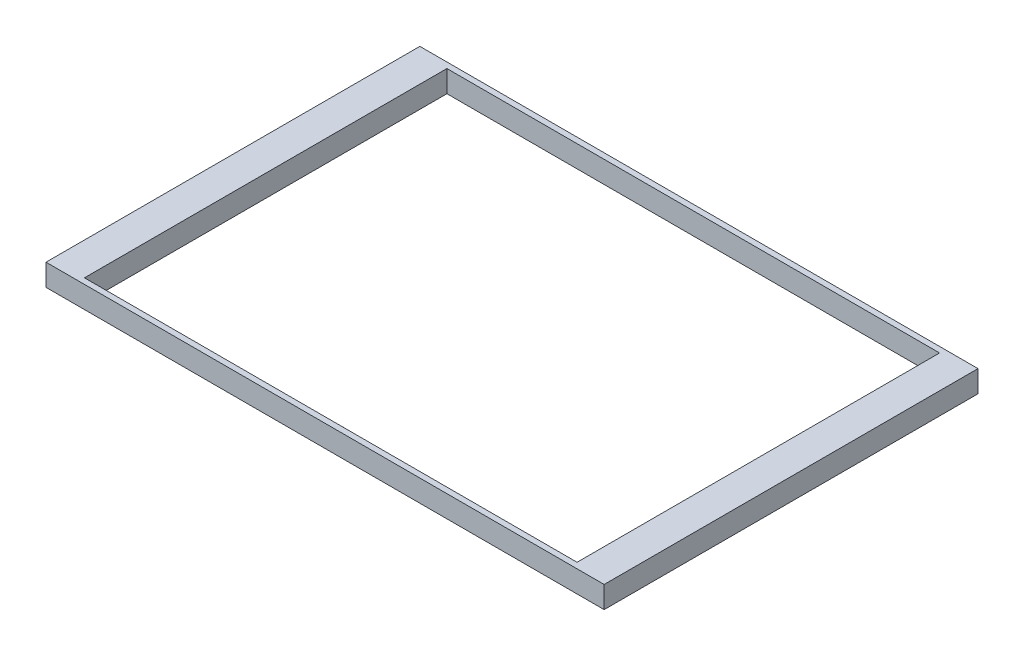
ISO-10303-21;
HEADER;
FILE_DESCRIPTION(('STEP AP214'),'2;1');
FILE_NAME('part.step','',(''),(''),'','','');
FILE_SCHEMA(('AUTOMOTIVE_DESIGN { 1 0 10303 214 1 1 1 1 }'));
ENDSEC;
DATA;
#1=APPLICATION_CONTEXT('core data for automotive mechanical design processes');
#2=APPLICATION_PROTOCOL_DEFINITION('international standard','automotive_design',2000,#1);
#3=PRODUCT_CONTEXT('',#1,'mechanical');
#4=PRODUCT('Part','Part','',(#3));
#5=PRODUCT_RELATED_PRODUCT_CATEGORY('part','',(#4));
#6=PRODUCT_DEFINITION_FORMATION('','',#4);
#7=PRODUCT_DEFINITION_CONTEXT('part definition',#1,'design');
#8=PRODUCT_DEFINITION('design','',#6,#7);
#9=PRODUCT_DEFINITION_SHAPE('','',#8);
#10=(LENGTH_UNIT() NAMED_UNIT(*) SI_UNIT(.MILLI.,.METRE.));
#11=(NAMED_UNIT(*) PLANE_ANGLE_UNIT() SI_UNIT($,.RADIAN.));
#12=(NAMED_UNIT(*) SI_UNIT($,.STERADIAN.) SOLID_ANGLE_UNIT());
#13=UNCERTAINTY_MEASURE_WITH_UNIT(LENGTH_MEASURE(1.E-05),#10,'distance_accuracy_value','');
#14=(GEOMETRIC_REPRESENTATION_CONTEXT(3) GLOBAL_UNCERTAINTY_ASSIGNED_CONTEXT((#13)) GLOBAL_UNIT_ASSIGNED_CONTEXT((#10,
#11,#12)) REPRESENTATION_CONTEXT('',''));
#15=CARTESIAN_POINT('',(0.,0.,0.));
#16=DIRECTION('',(0.,0.,1.));
#17=DIRECTION('',(1.,0.,0.));
#18=AXIS2_PLACEMENT_3D('',#15,#16,#17);
#19=CARTESIAN_POINT('',(-63.9,5.,42.8));
#20=DIRECTION('',(1.,0.,0.));
#21=DIRECTION('',(0.,0.,-1.));
#22=AXIS2_PLACEMENT_3D('',#19,#20,#21);
#23=PLANE('',#22);
#24=DIRECTION('',(0.,0.,1.));
#25=VECTOR('',#24,1.);
#26=CARTESIAN_POINT('',(-63.9,0.,42.8));
#27=LINE('',#26,#25);
#28=CARTESIAN_POINT('',(-63.9,0.,-42.8));
#29=VERTEX_POINT('',#28);
#30=CARTESIAN_POINT('',(-63.9,0.,42.8));
#31=VERTEX_POINT('',#30);
#32=EDGE_CURVE('E147',#29,#31,#27,.T.);
#33=ORIENTED_EDGE('',*,*,#32,.T.);
#34=DIRECTION('',(0.,-1.,0.));
#35=VECTOR('',#34,1.);
#36=CARTESIAN_POINT('',(-63.9,5.,42.8));
#37=LINE('',#36,#35);
#38=CARTESIAN_POINT('',(-63.9,5.,42.8));
#39=VERTEX_POINT('',#38);
#40=EDGE_CURVE('E11',#39,#31,#37,.T.);
#41=ORIENTED_EDGE('',*,*,#40,.F.);
#42=DIRECTION('',(0.,0.,1.));
#43=VECTOR('',#42,1.);
#44=CARTESIAN_POINT('',(-63.9,5.,42.8));
#45=LINE('',#44,#43);
#46=CARTESIAN_POINT('',(-63.9,5.,-42.8));
#47=VERTEX_POINT('',#46);
#48=EDGE_CURVE('E153',#47,#39,#45,.T.);
#49=ORIENTED_EDGE('',*,*,#48,.F.);
#50=DIRECTION('',(0.,-1.,0.));
#51=VECTOR('',#50,1.);
#52=CARTESIAN_POINT('',(-63.9,5.,-42.8));
#53=LINE('',#52,#51);
#54=EDGE_CURVE('E167',#47,#29,#53,.T.);
#55=ORIENTED_EDGE('',*,*,#54,.T.);
#56=EDGE_LOOP('',(#33,#41,#49,#55));
#57=FACE_BOUND('',#56,.T.);
#58=ADVANCED_FACE('F39',(#57),#23,.F.);
#59=CARTESIAN_POINT('',(63.9,5.,42.8));
#60=DIRECTION('',(0.,0.,-1.));
#61=DIRECTION('',(-1.,0.,0.));
#62=AXIS2_PLACEMENT_3D('',#59,#60,#61);
#63=PLANE('',#62);
#64=DIRECTION('',(1.,0.,0.));
#65=VECTOR('',#64,1.);
#66=CARTESIAN_POINT('',(63.9,0.,42.8));
#67=LINE('',#66,#65);
#68=CARTESIAN_POINT('',(63.9,0.,42.8));
#69=VERTEX_POINT('',#68);
#70=EDGE_CURVE('E171',#31,#69,#67,.T.);
#71=ORIENTED_EDGE('',*,*,#70,.T.);
#72=DIRECTION('',(0.,-1.,0.));
#73=VECTOR('',#72,1.);
#74=CARTESIAN_POINT('',(63.9,5.,42.8));
#75=LINE('',#74,#73);
#76=CARTESIAN_POINT('',(63.9,5.,42.8));
#77=VERTEX_POINT('',#76);
#78=EDGE_CURVE('E47',#77,#69,#75,.T.);
#79=ORIENTED_EDGE('',*,*,#78,.F.);
#80=DIRECTION('',(1.,0.,0.));
#81=VECTOR('',#80,1.);
#82=CARTESIAN_POINT('',(63.9,5.,42.8));
#83=LINE('',#82,#81);
#84=EDGE_CURVE('E157',#39,#77,#83,.T.);
#85=ORIENTED_EDGE('',*,*,#84,.F.);
#86=ORIENTED_EDGE('',*,*,#40,.T.);
#87=EDGE_LOOP('',(#71,#79,#85,#86));
#88=FACE_BOUND('',#87,.T.);
#89=ADVANCED_FACE('F205',(#88),#63,.F.);
#90=CARTESIAN_POINT('',(63.9,5.,42.8));
#91=DIRECTION('',(-1.,0.,0.));
#92=DIRECTION('',(0.,0.,1.));
#93=AXIS2_PLACEMENT_3D('',#90,#91,#92);
#94=PLANE('',#93);
#95=DIRECTION('',(0.,0.,-1.));
#96=VECTOR('',#95,1.);
#97=CARTESIAN_POINT('',(63.9,0.,42.8));
#98=LINE('',#97,#96);
#99=CARTESIAN_POINT('',(63.9,0.,-42.8));
#100=VERTEX_POINT('',#99);
#101=EDGE_CURVE('E174',#69,#100,#98,.T.);
#102=ORIENTED_EDGE('',*,*,#101,.T.);
#103=DIRECTION('',(0.,-1.,0.));
#104=VECTOR('',#103,1.);
#105=CARTESIAN_POINT('',(63.9,5.,-42.8));
#106=LINE('',#105,#104);
#107=CARTESIAN_POINT('',(63.9,5.,-42.8));
#108=VERTEX_POINT('',#107);
#109=EDGE_CURVE('E182',#108,#100,#106,.T.);
#110=ORIENTED_EDGE('',*,*,#109,.F.);
#111=DIRECTION('',(0.,0.,-1.));
#112=VECTOR('',#111,1.);
#113=CARTESIAN_POINT('',(63.9,5.,42.8));
#114=LINE('',#113,#112);
#115=EDGE_CURVE('E161',#77,#108,#114,.T.);
#116=ORIENTED_EDGE('',*,*,#115,.F.);
#117=ORIENTED_EDGE('',*,*,#78,.T.);
#118=EDGE_LOOP('',(#102,#110,#116,#117));
#119=FACE_BOUND('',#118,.T.);
#120=ADVANCED_FACE('F191',(#119),#94,.F.);
#121=CARTESIAN_POINT('',(63.9,5.,-42.8));
#122=DIRECTION('',(0.,0.,1.));
#123=DIRECTION('',(1.,0.,0.));
#124=AXIS2_PLACEMENT_3D('',#121,#122,#123);
#125=PLANE('',#124);
#126=DIRECTION('',(-1.,0.,0.));
#127=VECTOR('',#126,1.);
#128=CARTESIAN_POINT('',(63.9,0.,-42.8));
#129=LINE('',#128,#127);
#130=EDGE_CURVE('E158',#100,#29,#129,.T.);
#131=ORIENTED_EDGE('',*,*,#130,.T.);
#132=ORIENTED_EDGE('',*,*,#54,.F.);
#133=DIRECTION('',(-1.,0.,0.));
#134=VECTOR('',#133,1.);
#135=CARTESIAN_POINT('',(63.9,5.,-42.8));
#136=LINE('',#135,#134);
#137=EDGE_CURVE('E164',#108,#47,#136,.T.);
#138=ORIENTED_EDGE('',*,*,#137,.F.);
#139=ORIENTED_EDGE('',*,*,#109,.T.);
#140=EDGE_LOOP('',(#131,#132,#138,#139));
#141=FACE_BOUND('',#140,.T.);
#142=ADVANCED_FACE('F198',(#141),#125,.F.);
#143=CARTESIAN_POINT('',(0.,5.,0.));
#144=DIRECTION('',(0.,1.,0.));
#145=DIRECTION('',(0.,0.,1.));
#146=AXIS2_PLACEMENT_3D('',#143,#144,#145);
#147=PLANE('',#146);
#148=DIRECTION('',(0.,0.,1.));
#149=VECTOR('',#148,1.);
#150=CARTESIAN_POINT('',(-56.4,5.,41.5));
#151=LINE('',#150,#149);
#152=CARTESIAN_POINT('',(-56.4,5.,-41.5));
#153=VERTEX_POINT('',#152);
#154=CARTESIAN_POINT('',(-56.4,5.,41.5));
#155=VERTEX_POINT('',#154);
#156=EDGE_CURVE('E54',#153,#155,#151,.T.);
#157=ORIENTED_EDGE('',*,*,#156,.F.);
#158=DIRECTION('',(-1.,0.,0.));
#159=VECTOR('',#158,1.);
#160=CARTESIAN_POINT('',(56.4,5.,-41.5));
#161=LINE('',#160,#159);
#162=CARTESIAN_POINT('',(56.4,5.,-41.5));
#163=VERTEX_POINT('',#162);
#164=EDGE_CURVE('E125',#163,#153,#161,.T.);
#165=ORIENTED_EDGE('',*,*,#164,.F.);
#166=DIRECTION('',(0.,0.,-1.));
#167=VECTOR('',#166,1.);
#168=CARTESIAN_POINT('',(56.4,5.,41.5));
#169=LINE('',#168,#167);
#170=CARTESIAN_POINT('',(56.4,5.,41.5));
#171=VERTEX_POINT('',#170);
#172=EDGE_CURVE('E129',#171,#163,#169,.T.);
#173=ORIENTED_EDGE('',*,*,#172,.F.);
#174=DIRECTION('',(1.,0.,0.));
#175=VECTOR('',#174,1.);
#176=CARTESIAN_POINT('',(56.4,5.,41.5));
#177=LINE('',#176,#175);
#178=EDGE_CURVE('E138',#155,#171,#177,.T.);
#179=ORIENTED_EDGE('',*,*,#178,.F.);
#180=EDGE_LOOP('',(#157,#165,#173,#179));
#181=FACE_BOUND('',#180,.T.);
#182=ORIENTED_EDGE('',*,*,#48,.T.);
#183=ORIENTED_EDGE('',*,*,#84,.T.);
#184=ORIENTED_EDGE('',*,*,#115,.T.);
#185=ORIENTED_EDGE('',*,*,#137,.T.);
#186=EDGE_LOOP('',(#182,#183,#184,#185));
#187=FACE_BOUND('',#186,.T.);
#188=ADVANCED_FACE('F204',(#181,#187),#147,.T.);
#189=CARTESIAN_POINT('',(0.,0.,0.));
#190=DIRECTION('',(0.,1.,0.));
#191=DIRECTION('',(0.,0.,1.));
#192=AXIS2_PLACEMENT_3D('',#189,#190,#191);
#193=PLANE('',#192);
#194=DIRECTION('',(-1.,0.,0.));
#195=VECTOR('',#194,1.);
#196=CARTESIAN_POINT('',(56.4,0.,-41.5));
#197=LINE('',#196,#195);
#198=CARTESIAN_POINT('',(56.4,0.,-41.5));
#199=VERTEX_POINT('',#198);
#200=CARTESIAN_POINT('',(-56.4,0.,-41.5));
#201=VERTEX_POINT('',#200);
#202=EDGE_CURVE('E113',#199,#201,#197,.T.);
#203=ORIENTED_EDGE('',*,*,#202,.T.);
#204=DIRECTION('',(0.,0.,1.));
#205=VECTOR('',#204,1.);
#206=CARTESIAN_POINT('',(-56.4,0.,41.5));
#207=LINE('',#206,#205);
#208=CARTESIAN_POINT('',(-56.4,0.,41.5));
#209=VERTEX_POINT('',#208);
#210=EDGE_CURVE('E106',#201,#209,#207,.T.);
#211=ORIENTED_EDGE('',*,*,#210,.T.);
#212=DIRECTION('',(1.,0.,0.));
#213=VECTOR('',#212,1.);
#214=CARTESIAN_POINT('',(56.4,0.,41.5));
#215=LINE('',#214,#213);
#216=CARTESIAN_POINT('',(56.4,0.,41.5));
#217=VERTEX_POINT('',#216);
#218=EDGE_CURVE('E116',#209,#217,#215,.T.);
#219=ORIENTED_EDGE('',*,*,#218,.T.);
#220=DIRECTION('',(0.,0.,-1.));
#221=VECTOR('',#220,1.);
#222=CARTESIAN_POINT('',(56.4,0.,41.5));
#223=LINE('',#222,#221);
#224=EDGE_CURVE('E62',#217,#199,#223,.T.);
#225=ORIENTED_EDGE('',*,*,#224,.T.);
#226=EDGE_LOOP('',(#203,#211,#219,#225));
#227=FACE_BOUND('',#226,.T.);
#228=ORIENTED_EDGE('',*,*,#32,.F.);
#229=ORIENTED_EDGE('',*,*,#130,.F.);
#230=ORIENTED_EDGE('',*,*,#101,.F.);
#231=ORIENTED_EDGE('',*,*,#70,.F.);
#232=EDGE_LOOP('',(#228,#229,#230,#231));
#233=FACE_BOUND('',#232,.T.);
#234=ADVANCED_FACE('F121',(#227,#233),#193,.F.);
#235=CARTESIAN_POINT('',(-56.4,0.,41.5));
#236=DIRECTION('',(-1.,0.,0.));
#237=DIRECTION('',(0.,0.,1.));
#238=AXIS2_PLACEMENT_3D('',#235,#236,#237);
#239=PLANE('',#238);
#240=ORIENTED_EDGE('',*,*,#156,.T.);
#241=DIRECTION('',(0.,1.,0.));
#242=VECTOR('',#241,1.);
#243=CARTESIAN_POINT('',(-56.4,0.,41.5));
#244=LINE('',#243,#242);
#245=EDGE_CURVE('E102',#209,#155,#244,.T.);
#246=ORIENTED_EDGE('',*,*,#245,.F.);
#247=ORIENTED_EDGE('',*,*,#210,.F.);
#248=DIRECTION('',(0.,1.,0.));
#249=VECTOR('',#248,1.);
#250=CARTESIAN_POINT('',(-56.4,0.,-41.5));
#251=LINE('',#250,#249);
#252=EDGE_CURVE('E144',#201,#153,#251,.T.);
#253=ORIENTED_EDGE('',*,*,#252,.T.);
#254=EDGE_LOOP('',(#240,#246,#247,#253));
#255=FACE_BOUND('',#254,.T.);
#256=ADVANCED_FACE('F104',(#255),#239,.F.);
#257=CARTESIAN_POINT('',(56.4,0.,-41.5));
#258=DIRECTION('',(0.,0.,-1.));
#259=DIRECTION('',(-1.,0.,0.));
#260=AXIS2_PLACEMENT_3D('',#257,#258,#259);
#261=PLANE('',#260);
#262=ORIENTED_EDGE('',*,*,#164,.T.);
#263=ORIENTED_EDGE('',*,*,#252,.F.);
#264=ORIENTED_EDGE('',*,*,#202,.F.);
#265=DIRECTION('',(0.,1.,0.));
#266=VECTOR('',#265,1.);
#267=CARTESIAN_POINT('',(56.4,0.,-41.5));
#268=LINE('',#267,#266);
#269=EDGE_CURVE('E148',#199,#163,#268,.T.);
#270=ORIENTED_EDGE('',*,*,#269,.T.);
#271=EDGE_LOOP('',(#262,#263,#264,#270));
#272=FACE_BOUND('',#271,.T.);
#273=ADVANCED_FACE('F222',(#272),#261,.F.);
#274=CARTESIAN_POINT('',(56.4,0.,41.5));
#275=DIRECTION('',(1.,0.,0.));
#276=DIRECTION('',(0.,0.,-1.));
#277=AXIS2_PLACEMENT_3D('',#274,#275,#276);
#278=PLANE('',#277);
#279=ORIENTED_EDGE('',*,*,#172,.T.);
#280=ORIENTED_EDGE('',*,*,#269,.F.);
#281=ORIENTED_EDGE('',*,*,#224,.F.);
#282=DIRECTION('',(0.,1.,0.));
#283=VECTOR('',#282,1.);
#284=CARTESIAN_POINT('',(56.4,0.,41.5));
#285=LINE('',#284,#283);
#286=EDGE_CURVE('E112',#217,#171,#285,.T.);
#287=ORIENTED_EDGE('',*,*,#286,.T.);
#288=EDGE_LOOP('',(#279,#280,#281,#287));
#289=FACE_BOUND('',#288,.T.);
#290=ADVANCED_FACE('F225',(#289),#278,.F.);
#291=CARTESIAN_POINT('',(56.4,0.,41.5));
#292=DIRECTION('',(0.,0.,1.));
#293=DIRECTION('',(1.,0.,0.));
#294=AXIS2_PLACEMENT_3D('',#291,#292,#293);
#295=PLANE('',#294);
#296=ORIENTED_EDGE('',*,*,#178,.T.);
#297=ORIENTED_EDGE('',*,*,#286,.F.);
#298=ORIENTED_EDGE('',*,*,#218,.F.);
#299=ORIENTED_EDGE('',*,*,#245,.T.);
#300=EDGE_LOOP('',(#296,#297,#298,#299));
#301=FACE_BOUND('',#300,.T.);
#302=ADVANCED_FACE('F117',(#301),#295,.F.);
#303=CLOSED_SHELL('',(#58,#89,#120,#142,#188,#234,#256,#273,#290,#302));
#304=MANIFOLD_SOLID_BREP('B2',#303);
#305=ADVANCED_BREP_SHAPE_REPRESENTATION('',(#18,#304),#14);
#306=SHAPE_DEFINITION_REPRESENTATION(#9,#305);
ENDSEC;
END-ISO-10303-21;
